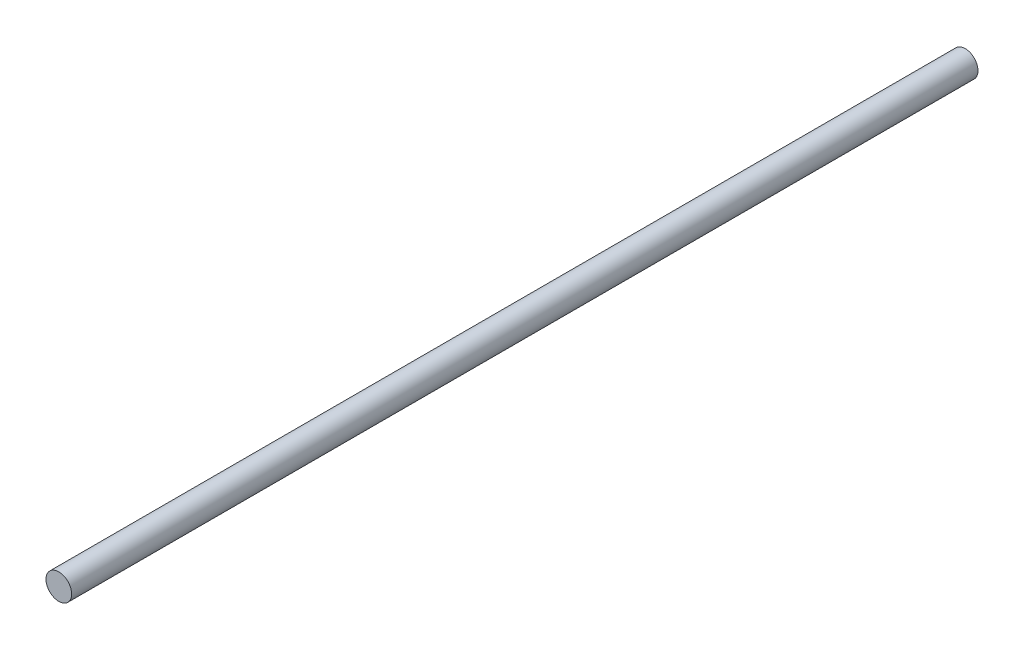
ISO-10303-21;
HEADER;
FILE_DESCRIPTION(('STEP AP214'),'2;1');
FILE_NAME('part.step','',(''),(''),'','','');
FILE_SCHEMA(('AUTOMOTIVE_DESIGN { 1 0 10303 214 1 1 1 1 }'));
ENDSEC;
DATA;
#1=APPLICATION_CONTEXT('core data for automotive mechanical design processes');
#2=APPLICATION_PROTOCOL_DEFINITION('international standard','automotive_design',2000,#1);
#3=PRODUCT_CONTEXT('',#1,'mechanical');
#4=PRODUCT('Part','Part','',(#3));
#5=PRODUCT_RELATED_PRODUCT_CATEGORY('part','',(#4));
#6=PRODUCT_DEFINITION_FORMATION('','',#4);
#7=PRODUCT_DEFINITION_CONTEXT('part definition',#1,'design');
#8=PRODUCT_DEFINITION('design','',#6,#7);
#9=PRODUCT_DEFINITION_SHAPE('','',#8);
#10=(LENGTH_UNIT() NAMED_UNIT(*) SI_UNIT(.MILLI.,.METRE.));
#11=(NAMED_UNIT(*) PLANE_ANGLE_UNIT() SI_UNIT($,.RADIAN.));
#12=(NAMED_UNIT(*) SI_UNIT($,.STERADIAN.) SOLID_ANGLE_UNIT());
#13=UNCERTAINTY_MEASURE_WITH_UNIT(LENGTH_MEASURE(1.E-05),#10,'distance_accuracy_value','');
#14=(GEOMETRIC_REPRESENTATION_CONTEXT(3) GLOBAL_UNCERTAINTY_ASSIGNED_CONTEXT((#13)) GLOBAL_UNIT_ASSIGNED_CONTEXT((#10,
#11,#12)) REPRESENTATION_CONTEXT('',''));
#15=CARTESIAN_POINT('',(0.,0.,0.));
#16=DIRECTION('',(0.,0.,1.));
#17=DIRECTION('',(1.,0.,0.));
#18=AXIS2_PLACEMENT_3D('',#15,#16,#17);
#19=CARTESIAN_POINT('',(0.,0.,179.54244));
#20=DIRECTION('',(0.,0.,-1.));
#21=DIRECTION('',(-1.,0.,0.));
#22=AXIS2_PLACEMENT_3D('',#19,#20,#21);
#23=CYLINDRICAL_SURFACE('',#22,2.54);
#24=CARTESIAN_POINT('',(0.,0.,179.54244));
#25=DIRECTION('',(0.,0.,1.));
#26=DIRECTION('',(1.,0.,0.));
#27=AXIS2_PLACEMENT_3D('',#24,#25,#26);
#28=CIRCLE('',#27,2.54);
#29=CARTESIAN_POINT('',(2.54,0.,179.54244));
#30=VERTEX_POINT('',#29);
#31=EDGE_CURVE('E10',#30,#30,#28,.T.);
#32=ORIENTED_EDGE('',*,*,#31,.F.);
#33=EDGE_LOOP('',(#32));
#34=FACE_BOUND('',#33,.T.);
#35=CARTESIAN_POINT('',(0.,0.,0.));
#36=DIRECTION('',(0.,0.,1.));
#37=DIRECTION('',(1.,0.,0.));
#38=AXIS2_PLACEMENT_3D('',#35,#36,#37);
#39=CIRCLE('',#38,2.54);
#40=CARTESIAN_POINT('',(2.54,0.,0.));
#41=VERTEX_POINT('',#40);
#42=EDGE_CURVE('E42',#41,#41,#39,.T.);
#43=ORIENTED_EDGE('',*,*,#42,.T.);
#44=EDGE_LOOP('',(#43));
#45=FACE_BOUND('',#44,.T.);
#46=ADVANCED_FACE('F41',(#34,#45),#23,.T.);
#47=CARTESIAN_POINT('',(0.,0.,179.54244));
#48=DIRECTION('',(0.,0.,1.));
#49=DIRECTION('',(1.,0.,0.));
#50=AXIS2_PLACEMENT_3D('',#47,#48,#49);
#51=PLANE('',#50);
#52=ORIENTED_EDGE('',*,*,#31,.T.);
#53=EDGE_LOOP('',(#52));
#54=FACE_BOUND('',#53,.T.);
#55=ADVANCED_FACE('F57',(#54),#51,.T.);
#56=CARTESIAN_POINT('',(0.,0.,0.));
#57=DIRECTION('',(0.,0.,1.));
#58=DIRECTION('',(1.,0.,0.));
#59=AXIS2_PLACEMENT_3D('',#56,#57,#58);
#60=PLANE('',#59);
#61=ORIENTED_EDGE('',*,*,#42,.F.);
#62=EDGE_LOOP('',(#61));
#63=FACE_BOUND('',#62,.T.);
#64=ADVANCED_FACE('F53',(#63),#60,.F.);
#65=CLOSED_SHELL('',(#46,#55,#64));
#66=MANIFOLD_SOLID_BREP('B2',#65);
#67=ADVANCED_BREP_SHAPE_REPRESENTATION('',(#18,#66),#14);
#68=SHAPE_DEFINITION_REPRESENTATION(#9,#67);
ENDSEC;
END-ISO-10303-21;
